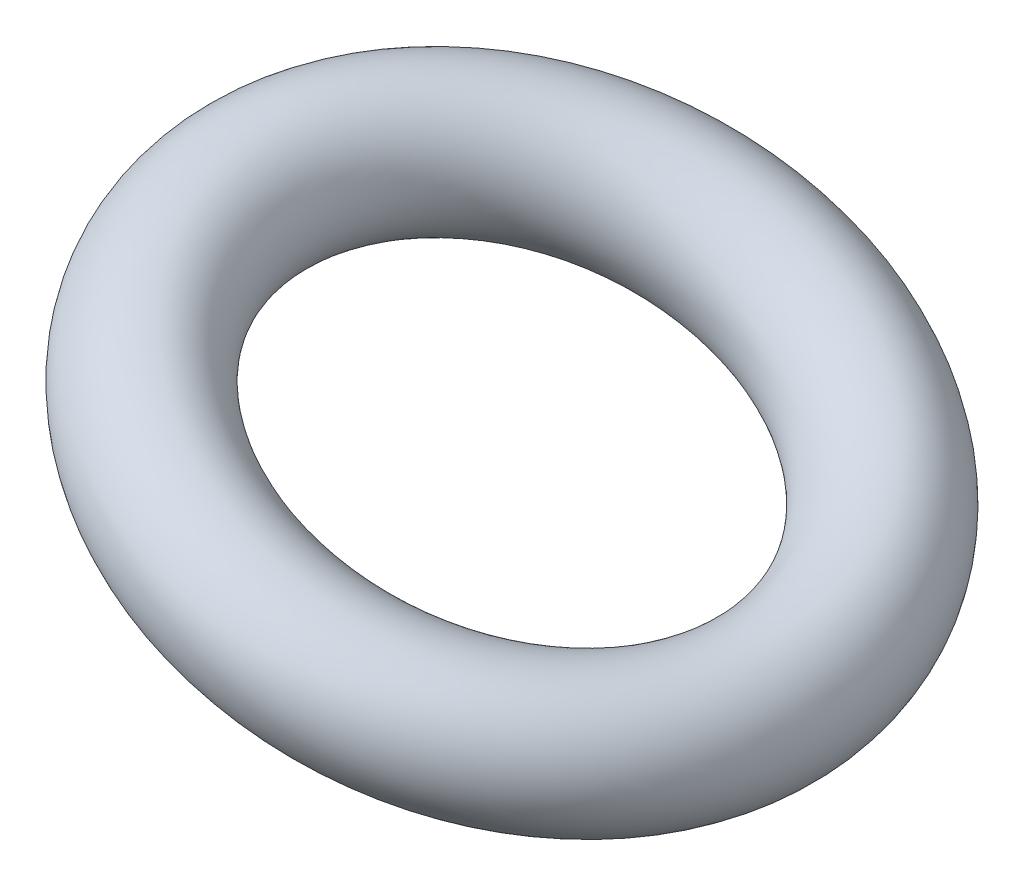
ISO-10303-21;
HEADER;
FILE_DESCRIPTION(('STEP AP214'),'2;1');
FILE_NAME('part.step','',(''),(''),'','','');
FILE_SCHEMA(('AUTOMOTIVE_DESIGN { 1 0 10303 214 1 1 1 1 }'));
ENDSEC;
DATA;
#1=APPLICATION_CONTEXT('core data for automotive mechanical design processes');
#2=APPLICATION_PROTOCOL_DEFINITION('international standard','automotive_design',2000,#1);
#3=PRODUCT_CONTEXT('',#1,'mechanical');
#4=PRODUCT('Part','Part','',(#3));
#5=PRODUCT_RELATED_PRODUCT_CATEGORY('part','',(#4));
#6=PRODUCT_DEFINITION_FORMATION('','',#4);
#7=PRODUCT_DEFINITION_CONTEXT('part definition',#1,'design');
#8=PRODUCT_DEFINITION('design','',#6,#7);
#9=PRODUCT_DEFINITION_SHAPE('','',#8);
#10=(LENGTH_UNIT() NAMED_UNIT(*) SI_UNIT(.MILLI.,.METRE.));
#11=(NAMED_UNIT(*) PLANE_ANGLE_UNIT() SI_UNIT($,.RADIAN.));
#12=(NAMED_UNIT(*) SI_UNIT($,.STERADIAN.) SOLID_ANGLE_UNIT());
#13=UNCERTAINTY_MEASURE_WITH_UNIT(LENGTH_MEASURE(1.E-05),#10,'distance_accuracy_value','');
#14=(GEOMETRIC_REPRESENTATION_CONTEXT(3) GLOBAL_UNCERTAINTY_ASSIGNED_CONTEXT((#13)) GLOBAL_UNIT_ASSIGNED_CONTEXT((#10,
#11,#12)) REPRESENTATION_CONTEXT('',''));
#15=CARTESIAN_POINT('',(0.,0.,0.));
#16=DIRECTION('',(0.,0.,1.));
#17=DIRECTION('',(1.,0.,0.));
#18=AXIS2_PLACEMENT_3D('',#15,#16,#17);
#19=CARTESIAN_POINT('',(-21.4282889625874,10.6773982397014,0.));
#20=DIRECTION('',(0.35593168157658,0.934511978548198,0.));
#21=DIRECTION('',(-0.934511978548198,0.35593168157658,0.));
#22=AXIS2_PLACEMENT_3D('',#19,#20,#21);
#23=TOROIDAL_SURFACE('',#22,10.,2.5);
#24=CARTESIAN_POINT('',(-33.1096886944399,15.1265442594087,0.));
#25=VERTEX_POINT('',#24);
#26=VERTEX_LOOP('',#25);
#27=FACE_BOUND('',#26,.T.);
#28=ADVANCED_FACE('F34',(#27),#23,.T.);
#29=CLOSED_SHELL('',(#28));
#30=MANIFOLD_SOLID_BREP('B2',#29);
#31=ADVANCED_BREP_SHAPE_REPRESENTATION('',(#18,#30),#14);
#32=SHAPE_DEFINITION_REPRESENTATION(#9,#31);
ENDSEC;
END-ISO-10303-21;
